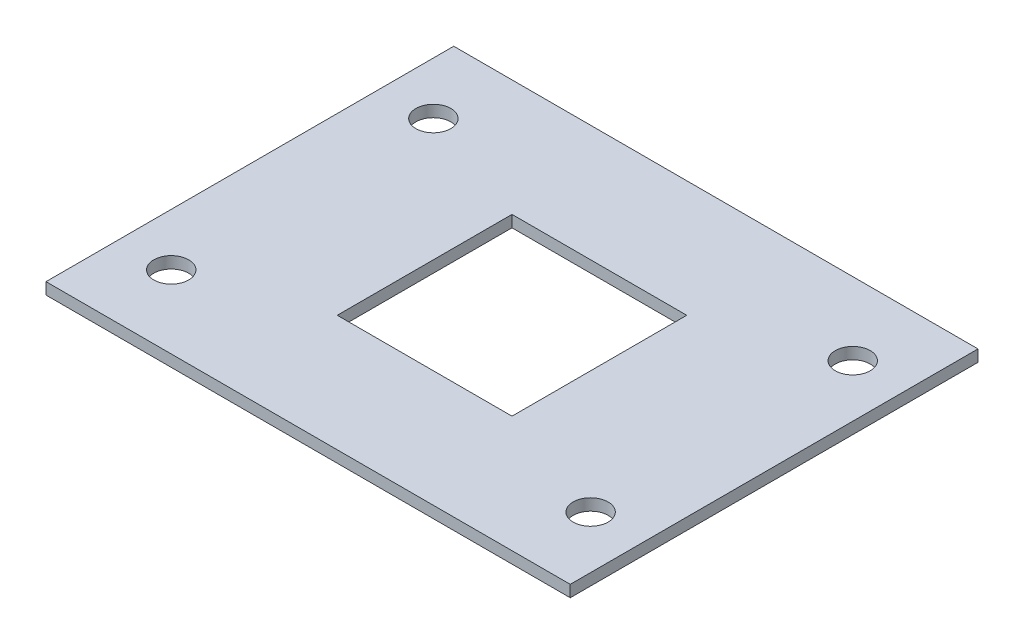
ISO-10303-21;
HEADER;
FILE_DESCRIPTION(('STEP AP214'),'2;1');
FILE_NAME('part.step','',(''),(''),'','','');
FILE_SCHEMA(('AUTOMOTIVE_DESIGN { 1 0 10303 214 1 1 1 1 }'));
ENDSEC;
DATA;
#1=APPLICATION_CONTEXT('core data for automotive mechanical design processes');
#2=APPLICATION_PROTOCOL_DEFINITION('international standard','automotive_design',2000,#1);
#3=PRODUCT_CONTEXT('',#1,'mechanical');
#4=PRODUCT('Part','Part','',(#3));
#5=PRODUCT_RELATED_PRODUCT_CATEGORY('part','',(#4));
#6=PRODUCT_DEFINITION_FORMATION('','',#4);
#7=PRODUCT_DEFINITION_CONTEXT('part definition',#1,'design');
#8=PRODUCT_DEFINITION('design','',#6,#7);
#9=PRODUCT_DEFINITION_SHAPE('','',#8);
#10=(LENGTH_UNIT() NAMED_UNIT(*) SI_UNIT(.MILLI.,.METRE.));
#11=(NAMED_UNIT(*) PLANE_ANGLE_UNIT() SI_UNIT($,.RADIAN.));
#12=(NAMED_UNIT(*) SI_UNIT($,.STERADIAN.) SOLID_ANGLE_UNIT());
#13=UNCERTAINTY_MEASURE_WITH_UNIT(LENGTH_MEASURE(1.E-05),#10,'distance_accuracy_value','');
#14=(GEOMETRIC_REPRESENTATION_CONTEXT(3) GLOBAL_UNCERTAINTY_ASSIGNED_CONTEXT((#13)) GLOBAL_UNIT_ASSIGNED_CONTEXT((#10,
#11,#12)) REPRESENTATION_CONTEXT('',''));
#15=CARTESIAN_POINT('',(0.,0.,0.));
#16=DIRECTION('',(0.,0.,1.));
#17=DIRECTION('',(1.,0.,0.));
#18=AXIS2_PLACEMENT_3D('',#15,#16,#17);
#19=CARTESIAN_POINT('',(-15.,1.,0.));
#20=DIRECTION('',(-1.,0.,0.));
#21=DIRECTION('',(0.,0.,1.));
#22=AXIS2_PLACEMENT_3D('',#19,#20,#21);
#23=PLANE('',#22);
#24=DIRECTION('',(0.,1.,0.));
#25=VECTOR('',#24,1.);
#26=CARTESIAN_POINT('',(-15.,-9.,10.));
#27=LINE('',#26,#25);
#28=CARTESIAN_POINT('',(-15.,0.,10.));
#29=VERTEX_POINT('',#28);
#30=CARTESIAN_POINT('',(-15.,1.,10.));
#31=VERTEX_POINT('',#30);
#32=EDGE_CURVE('E58',#29,#31,#27,.T.);
#33=ORIENTED_EDGE('',*,*,#32,.T.);
#34=DIRECTION('',(0.,0.,-1.));
#35=VECTOR('',#34,1.);
#36=CARTESIAN_POINT('',(-15.,1.,0.));
#37=LINE('',#36,#35);
#38=CARTESIAN_POINT('',(-15.,1.,-25.));
#39=VERTEX_POINT('',#38);
#40=EDGE_CURVE('E114',#31,#39,#37,.T.);
#41=ORIENTED_EDGE('',*,*,#40,.T.);
#42=DIRECTION('',(0.,1.,0.));
#43=VECTOR('',#42,1.);
#44=CARTESIAN_POINT('',(-15.,-9.,-25.));
#45=LINE('',#44,#43);
#46=CARTESIAN_POINT('',(-15.,0.,-25.));
#47=VERTEX_POINT('',#46);
#48=EDGE_CURVE('E165',#47,#39,#45,.T.);
#49=ORIENTED_EDGE('',*,*,#48,.F.);
#50=DIRECTION('',(0.,0.,-1.));
#51=VECTOR('',#50,1.);
#52=CARTESIAN_POINT('',(-15.,0.,0.));
#53=LINE('',#52,#51);
#54=EDGE_CURVE('E149',#29,#47,#53,.T.);
#55=ORIENTED_EDGE('',*,*,#54,.F.);
#56=EDGE_LOOP('',(#33,#41,#49,#55));
#57=FACE_BOUND('',#56,.T.);
#58=ADVANCED_FACE('F35',(#57),#23,.T.);
#59=CARTESIAN_POINT('',(30.,1.,0.));
#60=DIRECTION('',(-1.,0.,0.));
#61=DIRECTION('',(0.,0.,1.));
#62=AXIS2_PLACEMENT_3D('',#59,#60,#61);
#63=PLANE('',#62);
#64=DIRECTION('',(0.,0.,-1.));
#65=VECTOR('',#64,1.);
#66=CARTESIAN_POINT('',(30.,1.,0.));
#67=LINE('',#66,#65);
#68=CARTESIAN_POINT('',(30.,1.,10.));
#69=VERTEX_POINT('',#68);
#70=CARTESIAN_POINT('',(30.,1.,-25.));
#71=VERTEX_POINT('',#70);
#72=EDGE_CURVE('E112',#69,#71,#67,.T.);
#73=ORIENTED_EDGE('',*,*,#72,.F.);
#74=DIRECTION('',(0.,1.,0.));
#75=VECTOR('',#74,1.);
#76=CARTESIAN_POINT('',(30.,-9.,10.));
#77=LINE('',#76,#75);
#78=CARTESIAN_POINT('',(30.,0.,10.));
#79=VERTEX_POINT('',#78);
#80=EDGE_CURVE('E97',#79,#69,#77,.T.);
#81=ORIENTED_EDGE('',*,*,#80,.F.);
#82=DIRECTION('',(0.,0.,-1.));
#83=VECTOR('',#82,1.);
#84=CARTESIAN_POINT('',(30.,0.,0.));
#85=LINE('',#84,#83);
#86=CARTESIAN_POINT('',(30.,0.,-25.));
#87=VERTEX_POINT('',#86);
#88=EDGE_CURVE('E152',#79,#87,#85,.T.);
#89=ORIENTED_EDGE('',*,*,#88,.T.);
#90=DIRECTION('',(0.,1.,0.));
#91=VECTOR('',#90,1.);
#92=CARTESIAN_POINT('',(30.,-9.,-25.));
#93=LINE('',#92,#91);
#94=EDGE_CURVE('E50',#87,#71,#93,.T.);
#95=ORIENTED_EDGE('',*,*,#94,.T.);
#96=EDGE_LOOP('',(#73,#81,#89,#95));
#97=FACE_BOUND('',#96,.T.);
#98=ADVANCED_FACE('F116',(#97),#63,.F.);
#99=CARTESIAN_POINT('',(15.,1.,0.));
#100=DIRECTION('',(-1.,0.,0.));
#101=DIRECTION('',(0.,0.,1.));
#102=AXIS2_PLACEMENT_3D('',#99,#100,#101);
#103=PLANE('',#102);
#104=DIRECTION('',(0.,0.,-1.));
#105=VECTOR('',#104,1.);
#106=CARTESIAN_POINT('',(15.,0.,0.));
#107=LINE('',#106,#105);
#108=CARTESIAN_POINT('',(15.,0.,0.));
#109=VERTEX_POINT('',#108);
#110=CARTESIAN_POINT('',(15.,0.,-15.));
#111=VERTEX_POINT('',#110);
#112=EDGE_CURVE('E134',#109,#111,#107,.T.);
#113=ORIENTED_EDGE('',*,*,#112,.F.);
#114=DIRECTION('',(0.,-1.,0.));
#115=VECTOR('',#114,1.);
#116=CARTESIAN_POINT('',(15.,1.,0.));
#117=LINE('',#116,#115);
#118=CARTESIAN_POINT('',(15.,1.,0.));
#119=VERTEX_POINT('',#118);
#120=EDGE_CURVE('E159',#119,#109,#117,.T.);
#121=ORIENTED_EDGE('',*,*,#120,.F.);
#122=DIRECTION('',(0.,0.,-1.));
#123=VECTOR('',#122,1.);
#124=CARTESIAN_POINT('',(15.,1.,0.));
#125=LINE('',#124,#123);
#126=CARTESIAN_POINT('',(15.,1.,-15.));
#127=VERTEX_POINT('',#126);
#128=EDGE_CURVE('E180',#119,#127,#125,.T.);
#129=ORIENTED_EDGE('',*,*,#128,.T.);
#130=DIRECTION('',(0.,-1.,0.));
#131=VECTOR('',#130,1.);
#132=CARTESIAN_POINT('',(15.,1.,-15.));
#133=LINE('',#132,#131);
#134=EDGE_CURVE('E117',#127,#111,#133,.T.);
#135=ORIENTED_EDGE('',*,*,#134,.T.);
#136=EDGE_LOOP('',(#113,#121,#129,#135));
#137=FACE_BOUND('',#136,.T.);
#138=ADVANCED_FACE('F218',(#137),#103,.T.);
#139=CARTESIAN_POINT('',(0.,1.,0.));
#140=DIRECTION('',(0.,0.,-1.));
#141=DIRECTION('',(-1.,0.,0.));
#142=AXIS2_PLACEMENT_3D('',#139,#140,#141);
#143=PLANE('',#142);
#144=DIRECTION('',(1.,0.,0.));
#145=VECTOR('',#144,1.);
#146=CARTESIAN_POINT('',(0.,0.,0.));
#147=LINE('',#146,#145);
#148=CARTESIAN_POINT('',(0.,0.,0.));
#149=VERTEX_POINT('',#148);
#150=EDGE_CURVE('E137',#149,#109,#147,.T.);
#151=ORIENTED_EDGE('',*,*,#150,.F.);
#152=DIRECTION('',(0.,-1.,0.));
#153=VECTOR('',#152,1.);
#154=CARTESIAN_POINT('',(0.,1.,0.));
#155=LINE('',#154,#153);
#156=CARTESIAN_POINT('',(0.,1.,0.));
#157=VERTEX_POINT('',#156);
#158=EDGE_CURVE('E157',#157,#149,#155,.T.);
#159=ORIENTED_EDGE('',*,*,#158,.F.);
#160=DIRECTION('',(1.,0.,0.));
#161=VECTOR('',#160,1.);
#162=CARTESIAN_POINT('',(0.,1.,0.));
#163=LINE('',#162,#161);
#164=EDGE_CURVE('E183',#157,#119,#163,.T.);
#165=ORIENTED_EDGE('',*,*,#164,.T.);
#166=ORIENTED_EDGE('',*,*,#120,.T.);
#167=EDGE_LOOP('',(#151,#159,#165,#166));
#168=FACE_BOUND('',#167,.T.);
#169=ADVANCED_FACE('F226',(#168),#143,.T.);
#170=CARTESIAN_POINT('',(0.,1.,0.));
#171=DIRECTION('',(-1.,0.,0.));
#172=DIRECTION('',(0.,0.,1.));
#173=AXIS2_PLACEMENT_3D('',#170,#171,#172);
#174=PLANE('',#173);
#175=DIRECTION('',(0.,0.,-1.));
#176=VECTOR('',#175,1.);
#177=CARTESIAN_POINT('',(0.,0.,0.));
#178=LINE('',#177,#176);
#179=CARTESIAN_POINT('',(0.,0.,-15.));
#180=VERTEX_POINT('',#179);
#181=EDGE_CURVE('E140',#149,#180,#178,.T.);
#182=ORIENTED_EDGE('',*,*,#181,.T.);
#183=DIRECTION('',(0.,-1.,0.));
#184=VECTOR('',#183,1.);
#185=CARTESIAN_POINT('',(0.,1.,-15.));
#186=LINE('',#185,#184);
#187=CARTESIAN_POINT('',(0.,1.,-15.));
#188=VERTEX_POINT('',#187);
#189=EDGE_CURVE('E119',#188,#180,#186,.T.);
#190=ORIENTED_EDGE('',*,*,#189,.F.);
#191=DIRECTION('',(0.,0.,-1.));
#192=VECTOR('',#191,1.);
#193=CARTESIAN_POINT('',(0.,1.,0.));
#194=LINE('',#193,#192);
#195=EDGE_CURVE('E186',#157,#188,#194,.T.);
#196=ORIENTED_EDGE('',*,*,#195,.F.);
#197=ORIENTED_EDGE('',*,*,#158,.T.);
#198=EDGE_LOOP('',(#182,#190,#196,#197));
#199=FACE_BOUND('',#198,.T.);
#200=ADVANCED_FACE('F198',(#199),#174,.F.);
#201=CARTESIAN_POINT('',(-10.5,1.,3.75));
#202=DIRECTION('',(0.,-1.,0.));
#203=DIRECTION('',(0.,0.,-1.));
#204=AXIS2_PLACEMENT_3D('',#201,#202,#203);
#205=CYLINDRICAL_SURFACE('',#204,1.5);
#206=CARTESIAN_POINT('',(-10.5,1.,3.75));
#207=DIRECTION('',(0.,1.,0.));
#208=DIRECTION('',(0.,0.,1.));
#209=AXIS2_PLACEMENT_3D('',#206,#207,#208);
#210=CIRCLE('',#209,1.5);
#211=CARTESIAN_POINT('',(-10.5,1.,5.25));
#212=VERTEX_POINT('',#211);
#213=EDGE_CURVE('E121',#212,#212,#210,.F.);
#214=ORIENTED_EDGE('',*,*,#213,.F.);
#215=EDGE_LOOP('',(#214));
#216=FACE_BOUND('',#215,.T.);
#217=CARTESIAN_POINT('',(-10.5,0.,3.75));
#218=DIRECTION('',(0.,1.,0.));
#219=DIRECTION('',(0.,0.,1.));
#220=AXIS2_PLACEMENT_3D('',#217,#218,#219);
#221=CIRCLE('',#220,1.5);
#222=CARTESIAN_POINT('',(-10.5,0.,5.25));
#223=VERTEX_POINT('',#222);
#224=EDGE_CURVE('E146',#223,#223,#221,.F.);
#225=ORIENTED_EDGE('',*,*,#224,.T.);
#226=EDGE_LOOP('',(#225));
#227=FACE_BOUND('',#226,.T.);
#228=ADVANCED_FACE('F194',(#216,#227),#205,.F.);
#229=CARTESIAN_POINT('',(0.,1.,-15.));
#230=DIRECTION('',(0.,0.,-1.));
#231=DIRECTION('',(-1.,0.,0.));
#232=AXIS2_PLACEMENT_3D('',#229,#230,#231);
#233=PLANE('',#232);
#234=DIRECTION('',(1.,0.,0.));
#235=VECTOR('',#234,1.);
#236=CARTESIAN_POINT('',(0.,0.,-15.));
#237=LINE('',#236,#235);
#238=EDGE_CURVE('E143',#180,#111,#237,.T.);
#239=ORIENTED_EDGE('',*,*,#238,.T.);
#240=ORIENTED_EDGE('',*,*,#134,.F.);
#241=DIRECTION('',(1.,0.,0.));
#242=VECTOR('',#241,1.);
#243=CARTESIAN_POINT('',(0.,1.,-15.));
#244=LINE('',#243,#242);
#245=EDGE_CURVE('E189',#188,#127,#244,.T.);
#246=ORIENTED_EDGE('',*,*,#245,.F.);
#247=ORIENTED_EDGE('',*,*,#189,.T.);
#248=EDGE_LOOP('',(#239,#240,#246,#247));
#249=FACE_BOUND('',#248,.T.);
#250=ADVANCED_FACE('F197',(#249),#233,.F.);
#251=CARTESIAN_POINT('',(-10.5,1.,-18.75));
#252=DIRECTION('',(0.,-1.,0.));
#253=DIRECTION('',(0.,0.,-1.));
#254=AXIS2_PLACEMENT_3D('',#251,#252,#253);
#255=CYLINDRICAL_SURFACE('',#254,1.5);
#256=CARTESIAN_POINT('',(-10.5,1.,-18.75));
#257=DIRECTION('',(0.,1.,0.));
#258=DIRECTION('',(0.,0.,1.));
#259=AXIS2_PLACEMENT_3D('',#256,#257,#258);
#260=CIRCLE('',#259,1.5);
#261=CARTESIAN_POINT('',(-10.5,1.,-17.25));
#262=VERTEX_POINT('',#261);
#263=EDGE_CURVE('E177',#262,#262,#260,.F.);
#264=ORIENTED_EDGE('',*,*,#263,.F.);
#265=EDGE_LOOP('',(#264));
#266=FACE_BOUND('',#265,.T.);
#267=CARTESIAN_POINT('',(-10.5,0.,-18.75));
#268=DIRECTION('',(0.,1.,0.));
#269=DIRECTION('',(0.,0.,1.));
#270=AXIS2_PLACEMENT_3D('',#267,#268,#269);
#271=CIRCLE('',#270,1.5);
#272=CARTESIAN_POINT('',(-10.5,0.,-17.25));
#273=VERTEX_POINT('',#272);
#274=EDGE_CURVE('E131',#273,#273,#271,.F.);
#275=ORIENTED_EDGE('',*,*,#274,.T.);
#276=EDGE_LOOP('',(#275));
#277=FACE_BOUND('',#276,.T.);
#278=ADVANCED_FACE('F222',(#266,#277),#255,.F.);
#279=CARTESIAN_POINT('',(25.5,1.,-18.75));
#280=DIRECTION('',(0.,-1.,0.));
#281=DIRECTION('',(0.,0.,-1.));
#282=AXIS2_PLACEMENT_3D('',#279,#280,#281);
#283=CYLINDRICAL_SURFACE('',#282,1.5);
#284=CARTESIAN_POINT('',(25.5,1.,-18.75));
#285=DIRECTION('',(0.,1.,0.));
#286=DIRECTION('',(0.,0.,1.));
#287=AXIS2_PLACEMENT_3D('',#284,#285,#286);
#288=CIRCLE('',#287,1.5);
#289=CARTESIAN_POINT('',(25.5,1.,-17.25));
#290=VERTEX_POINT('',#289);
#291=EDGE_CURVE('E174',#290,#290,#288,.T.);
#292=ORIENTED_EDGE('',*,*,#291,.T.);
#293=EDGE_LOOP('',(#292));
#294=FACE_BOUND('',#293,.T.);
#295=CARTESIAN_POINT('',(25.5,0.,-18.75));
#296=DIRECTION('',(0.,1.,0.));
#297=DIRECTION('',(0.,0.,1.));
#298=AXIS2_PLACEMENT_3D('',#295,#296,#297);
#299=CIRCLE('',#298,1.5);
#300=CARTESIAN_POINT('',(25.5,0.,-17.25));
#301=VERTEX_POINT('',#300);
#302=EDGE_CURVE('E128',#301,#301,#299,.T.);
#303=ORIENTED_EDGE('',*,*,#302,.F.);
#304=EDGE_LOOP('',(#303));
#305=FACE_BOUND('',#304,.T.);
#306=ADVANCED_FACE('F235',(#294,#305),#283,.F.);
#307=CARTESIAN_POINT('',(25.5,1.,3.75));
#308=DIRECTION('',(0.,-1.,0.));
#309=DIRECTION('',(0.,0.,-1.));
#310=AXIS2_PLACEMENT_3D('',#307,#308,#309);
#311=CYLINDRICAL_SURFACE('',#310,1.5);
#312=CARTESIAN_POINT('',(25.5,1.,3.75));
#313=DIRECTION('',(0.,1.,0.));
#314=DIRECTION('',(0.,0.,1.));
#315=AXIS2_PLACEMENT_3D('',#312,#313,#314);
#316=CIRCLE('',#315,1.5);
#317=CARTESIAN_POINT('',(25.5,1.,5.25));
#318=VERTEX_POINT('',#317);
#319=EDGE_CURVE('E153',#318,#318,#316,.T.);
#320=ORIENTED_EDGE('',*,*,#319,.T.);
#321=EDGE_LOOP('',(#320));
#322=FACE_BOUND('',#321,.T.);
#323=CARTESIAN_POINT('',(25.5,0.,3.75));
#324=DIRECTION('',(0.,1.,0.));
#325=DIRECTION('',(0.,0.,1.));
#326=AXIS2_PLACEMENT_3D('',#323,#324,#325);
#327=CIRCLE('',#326,1.5);
#328=CARTESIAN_POINT('',(25.5,0.,5.25));
#329=VERTEX_POINT('',#328);
#330=EDGE_CURVE('E125',#329,#329,#327,.T.);
#331=ORIENTED_EDGE('',*,*,#330,.F.);
#332=EDGE_LOOP('',(#331));
#333=FACE_BOUND('',#332,.T.);
#334=ADVANCED_FACE('F37',(#322,#333),#311,.F.);
#335=CARTESIAN_POINT('',(0.,1.,0.));
#336=DIRECTION('',(0.,1.,0.));
#337=DIRECTION('',(0.,0.,1.));
#338=AXIS2_PLACEMENT_3D('',#335,#336,#337);
#339=PLANE('',#338);
#340=DIRECTION('',(-1.,0.,0.));
#341=VECTOR('',#340,1.);
#342=CARTESIAN_POINT('',(30.,1.,10.));
#343=LINE('',#342,#341);
#344=EDGE_CURVE('E100',#69,#31,#343,.T.);
#345=ORIENTED_EDGE('',*,*,#344,.F.);
#346=ORIENTED_EDGE('',*,*,#72,.T.);
#347=DIRECTION('',(1.,0.,0.));
#348=VECTOR('',#347,1.);
#349=CARTESIAN_POINT('',(30.,1.,-25.));
#350=LINE('',#349,#348);
#351=EDGE_CURVE('E167',#39,#71,#350,.T.);
#352=ORIENTED_EDGE('',*,*,#351,.F.);
#353=ORIENTED_EDGE('',*,*,#40,.F.);
#354=EDGE_LOOP('',(#345,#346,#352,#353));
#355=FACE_BOUND('',#354,.T.);
#356=ORIENTED_EDGE('',*,*,#319,.F.);
#357=EDGE_LOOP('',(#356));
#358=FACE_BOUND('',#357,.T.);
#359=ORIENTED_EDGE('',*,*,#291,.F.);
#360=EDGE_LOOP('',(#359));
#361=FACE_BOUND('',#360,.T.);
#362=ORIENTED_EDGE('',*,*,#263,.T.);
#363=EDGE_LOOP('',(#362));
#364=FACE_BOUND('',#363,.T.);
#365=ORIENTED_EDGE('',*,*,#128,.F.);
#366=ORIENTED_EDGE('',*,*,#164,.F.);
#367=ORIENTED_EDGE('',*,*,#195,.T.);
#368=ORIENTED_EDGE('',*,*,#245,.T.);
#369=EDGE_LOOP('',(#365,#366,#367,#368));
#370=FACE_BOUND('',#369,.T.);
#371=ORIENTED_EDGE('',*,*,#213,.T.);
#372=EDGE_LOOP('',(#371));
#373=FACE_BOUND('',#372,.T.);
#374=ADVANCED_FACE('F109',(#355,#358,#361,#364,#370,#373),#339,.T.);
#375=CARTESIAN_POINT('',(0.,0.,0.));
#376=DIRECTION('',(0.,1.,0.));
#377=DIRECTION('',(0.,0.,1.));
#378=AXIS2_PLACEMENT_3D('',#375,#376,#377);
#379=PLANE('',#378);
#380=ORIENTED_EDGE('',*,*,#330,.T.);
#381=EDGE_LOOP('',(#380));
#382=FACE_BOUND('',#381,.T.);
#383=ORIENTED_EDGE('',*,*,#302,.T.);
#384=EDGE_LOOP('',(#383));
#385=FACE_BOUND('',#384,.T.);
#386=ORIENTED_EDGE('',*,*,#274,.F.);
#387=EDGE_LOOP('',(#386));
#388=FACE_BOUND('',#387,.T.);
#389=ORIENTED_EDGE('',*,*,#112,.T.);
#390=ORIENTED_EDGE('',*,*,#238,.F.);
#391=ORIENTED_EDGE('',*,*,#181,.F.);
#392=ORIENTED_EDGE('',*,*,#150,.T.);
#393=EDGE_LOOP('',(#389,#390,#391,#392));
#394=FACE_BOUND('',#393,.T.);
#395=ORIENTED_EDGE('',*,*,#224,.F.);
#396=EDGE_LOOP('',(#395));
#397=FACE_BOUND('',#396,.T.);
#398=ORIENTED_EDGE('',*,*,#88,.F.);
#399=DIRECTION('',(-1.,0.,0.));
#400=VECTOR('',#399,1.);
#401=CARTESIAN_POINT('',(0.,0.,10.));
#402=LINE('',#401,#400);
#403=EDGE_CURVE('E11',#79,#29,#402,.T.);
#404=ORIENTED_EDGE('',*,*,#403,.T.);
#405=ORIENTED_EDGE('',*,*,#54,.T.);
#406=DIRECTION('',(1.,0.,0.));
#407=VECTOR('',#406,1.);
#408=CARTESIAN_POINT('',(0.,0.,-25.));
#409=LINE('',#408,#407);
#410=EDGE_CURVE('E43',#47,#87,#409,.T.);
#411=ORIENTED_EDGE('',*,*,#410,.T.);
#412=EDGE_LOOP('',(#398,#404,#405,#411));
#413=FACE_BOUND('',#412,.T.);
#414=ADVANCED_FACE('F161',(#382,#385,#388,#394,#397,#413),#379,.F.);
#415=CARTESIAN_POINT('',(30.,-9.,-25.));
#416=DIRECTION('',(0.,0.,1.));
#417=DIRECTION('',(1.,0.,0.));
#418=AXIS2_PLACEMENT_3D('',#415,#416,#417);
#419=PLANE('',#418);
#420=ORIENTED_EDGE('',*,*,#48,.T.);
#421=ORIENTED_EDGE('',*,*,#351,.T.);
#422=ORIENTED_EDGE('',*,*,#94,.F.);
#423=ORIENTED_EDGE('',*,*,#410,.F.);
#424=EDGE_LOOP('',(#420,#421,#422,#423));
#425=FACE_BOUND('',#424,.T.);
#426=ADVANCED_FACE('F164',(#425),#419,.F.);
#427=CARTESIAN_POINT('',(30.,-9.,10.));
#428=DIRECTION('',(0.,0.,-1.));
#429=DIRECTION('',(-1.,0.,0.));
#430=AXIS2_PLACEMENT_3D('',#427,#428,#429);
#431=PLANE('',#430);
#432=ORIENTED_EDGE('',*,*,#80,.T.);
#433=ORIENTED_EDGE('',*,*,#344,.T.);
#434=ORIENTED_EDGE('',*,*,#32,.F.);
#435=ORIENTED_EDGE('',*,*,#403,.F.);
#436=EDGE_LOOP('',(#432,#433,#434,#435));
#437=FACE_BOUND('',#436,.T.);
#438=ADVANCED_FACE('F99',(#437),#431,.F.);
#439=CLOSED_SHELL('',(#58,#98,#138,#169,#200,#228,#250,#278,#306,#334,#374,#414,#426,#438));
#440=MANIFOLD_SOLID_BREP('B2',#439);
#441=ADVANCED_BREP_SHAPE_REPRESENTATION('',(#18,#440),#14);
#442=SHAPE_DEFINITION_REPRESENTATION(#9,#441);
ENDSEC;
END-ISO-10303-21;
